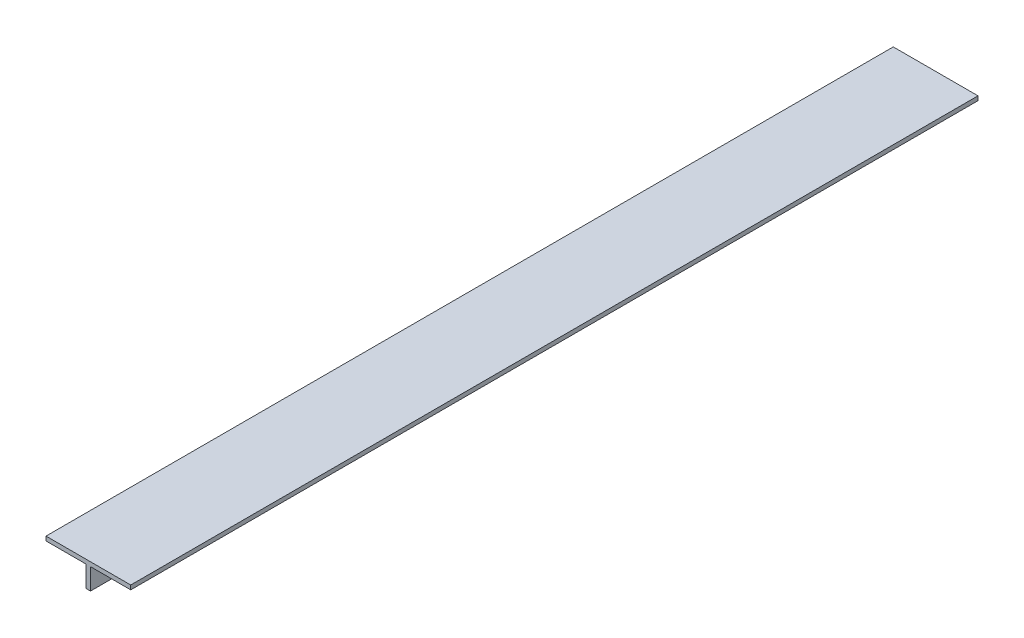
ISO-10303-21;
HEADER;
FILE_DESCRIPTION(('STEP AP214'),'2;1');
FILE_NAME('part.step','',(''),(''),'','','');
FILE_SCHEMA(('AUTOMOTIVE_DESIGN { 1 0 10303 214 1 1 1 1 }'));
ENDSEC;
DATA;
#1=APPLICATION_CONTEXT('core data for automotive mechanical design processes');
#2=APPLICATION_PROTOCOL_DEFINITION('international standard','automotive_design',2000,#1);
#3=PRODUCT_CONTEXT('',#1,'mechanical');
#4=PRODUCT('Part','Part','',(#3));
#5=PRODUCT_RELATED_PRODUCT_CATEGORY('part','',(#4));
#6=PRODUCT_DEFINITION_FORMATION('','',#4);
#7=PRODUCT_DEFINITION_CONTEXT('part definition',#1,'design');
#8=PRODUCT_DEFINITION('design','',#6,#7);
#9=PRODUCT_DEFINITION_SHAPE('','',#8);
#10=(LENGTH_UNIT() NAMED_UNIT(*) SI_UNIT(.MILLI.,.METRE.));
#11=(NAMED_UNIT(*) PLANE_ANGLE_UNIT() SI_UNIT($,.RADIAN.));
#12=(NAMED_UNIT(*) SI_UNIT($,.STERADIAN.) SOLID_ANGLE_UNIT());
#13=UNCERTAINTY_MEASURE_WITH_UNIT(LENGTH_MEASURE(1.E-05),#10,'distance_accuracy_value','');
#14=(GEOMETRIC_REPRESENTATION_CONTEXT(3) GLOBAL_UNCERTAINTY_ASSIGNED_CONTEXT((#13)) GLOBAL_UNIT_ASSIGNED_CONTEXT((#10,
#11,#12)) REPRESENTATION_CONTEXT('',''));
#15=CARTESIAN_POINT('',(0.,0.,0.));
#16=DIRECTION('',(0.,0.,1.));
#17=DIRECTION('',(1.,0.,0.));
#18=AXIS2_PLACEMENT_3D('',#15,#16,#17);
#19=CARTESIAN_POINT('',(0.,0.,50800.));
#20=DIRECTION('',(1.,0.,0.));
#21=DIRECTION('',(0.,1.,0.));
#22=AXIS2_PLACEMENT_3D('',#19,#20,#21);
#23=PLANE('',#22);
#24=DIRECTION('',(0.,-1.,0.));
#25=VECTOR('',#24,1.);
#26=CARTESIAN_POINT('',(0.,0.,0.));
#27=LINE('',#26,#25);
#28=CARTESIAN_POINT('',(0.,0.,0.));
#29=VERTEX_POINT('',#28);
#30=CARTESIAN_POINT('',(0.,-254.,0.));
#31=VERTEX_POINT('',#30);
#32=EDGE_CURVE('E132',#29,#31,#27,.T.);
#33=ORIENTED_EDGE('',*,*,#32,.T.);
#34=DIRECTION('',(0.,0.,-1.));
#35=VECTOR('',#34,1.);
#36=CARTESIAN_POINT('',(0.,-254.,50800.));
#37=LINE('',#36,#35);
#38=CARTESIAN_POINT('',(0.,-254.,50800.));
#39=VERTEX_POINT('',#38);
#40=EDGE_CURVE('E11',#39,#31,#37,.T.);
#41=ORIENTED_EDGE('',*,*,#40,.F.);
#42=DIRECTION('',(0.,-1.,0.));
#43=VECTOR('',#42,1.);
#44=CARTESIAN_POINT('',(0.,0.,50800.));
#45=LINE('',#44,#43);
#46=CARTESIAN_POINT('',(0.,0.,50800.));
#47=VERTEX_POINT('',#46);
#48=EDGE_CURVE('E146',#47,#39,#45,.T.);
#49=ORIENTED_EDGE('',*,*,#48,.F.);
#50=DIRECTION('',(0.,0.,-1.));
#51=VECTOR('',#50,1.);
#52=CARTESIAN_POINT('',(0.,0.,50800.));
#53=LINE('',#52,#51);
#54=EDGE_CURVE('E128',#47,#29,#53,.T.);
#55=ORIENTED_EDGE('',*,*,#54,.T.);
#56=EDGE_LOOP('',(#33,#41,#49,#55));
#57=FACE_BOUND('',#56,.T.);
#58=ADVANCED_FACE('F36',(#57),#23,.F.);
#59=CARTESIAN_POINT('',(0.,-254.,50800.));
#60=DIRECTION('',(0.,1.,0.));
#61=DIRECTION('',(0.,0.,1.));
#62=AXIS2_PLACEMENT_3D('',#59,#60,#61);
#63=PLANE('',#62);
#64=DIRECTION('',(1.,0.,0.));
#65=VECTOR('',#64,1.);
#66=CARTESIAN_POINT('',(0.,-254.,0.));
#67=LINE('',#66,#65);
#68=CARTESIAN_POINT('',(2413.,-254.,0.));
#69=VERTEX_POINT('',#68);
#70=EDGE_CURVE('E135',#31,#69,#67,.T.);
#71=ORIENTED_EDGE('',*,*,#70,.T.);
#72=DIRECTION('',(0.,0.,-1.));
#73=VECTOR('',#72,1.);
#74=CARTESIAN_POINT('',(2413.,-254.,50800.));
#75=LINE('',#74,#73);
#76=CARTESIAN_POINT('',(2413.,-254.,50800.));
#77=VERTEX_POINT('',#76);
#78=EDGE_CURVE('E44',#77,#69,#75,.T.);
#79=ORIENTED_EDGE('',*,*,#78,.F.);
#80=DIRECTION('',(1.,0.,0.));
#81=VECTOR('',#80,1.);
#82=CARTESIAN_POINT('',(0.,-254.,50800.));
#83=LINE('',#82,#81);
#84=EDGE_CURVE('E95',#39,#77,#83,.T.);
#85=ORIENTED_EDGE('',*,*,#84,.F.);
#86=ORIENTED_EDGE('',*,*,#40,.T.);
#87=EDGE_LOOP('',(#71,#79,#85,#86));
#88=FACE_BOUND('',#87,.T.);
#89=ADVANCED_FACE('F181',(#88),#63,.F.);
#90=CARTESIAN_POINT('',(2413.,-254.,50800.));
#91=DIRECTION('',(1.,0.,0.));
#92=DIRECTION('',(0.,0.,-1.));
#93=AXIS2_PLACEMENT_3D('',#90,#91,#92);
#94=PLANE('',#93);
#95=DIRECTION('',(0.,-1.,0.));
#96=VECTOR('',#95,1.);
#97=CARTESIAN_POINT('',(2413.,-254.,0.));
#98=LINE('',#97,#96);
#99=CARTESIAN_POINT('',(2413.,-1524.,0.));
#100=VERTEX_POINT('',#99);
#101=EDGE_CURVE('E137',#69,#100,#98,.T.);
#102=ORIENTED_EDGE('',*,*,#101,.T.);
#103=DIRECTION('',(0.,0.,-1.));
#104=VECTOR('',#103,1.);
#105=CARTESIAN_POINT('',(2413.,-1524.,50800.));
#106=LINE('',#105,#104);
#107=CARTESIAN_POINT('',(2413.,-1524.,50800.));
#108=VERTEX_POINT('',#107);
#109=EDGE_CURVE('E153',#108,#100,#106,.T.);
#110=ORIENTED_EDGE('',*,*,#109,.F.);
#111=DIRECTION('',(0.,-1.,0.));
#112=VECTOR('',#111,1.);
#113=CARTESIAN_POINT('',(2413.,-254.,50800.));
#114=LINE('',#113,#112);
#115=EDGE_CURVE('E161',#77,#108,#114,.T.);
#116=ORIENTED_EDGE('',*,*,#115,.F.);
#117=ORIENTED_EDGE('',*,*,#78,.T.);
#118=EDGE_LOOP('',(#102,#110,#116,#117));
#119=FACE_BOUND('',#118,.T.);
#120=ADVANCED_FACE('F159',(#119),#94,.F.);
#121=CARTESIAN_POINT('',(2413.,-1524.,50800.));
#122=DIRECTION('',(0.,1.,0.));
#123=DIRECTION('',(0.,0.,1.));
#124=AXIS2_PLACEMENT_3D('',#121,#122,#123);
#125=PLANE('',#124);
#126=DIRECTION('',(1.,0.,0.));
#127=VECTOR('',#126,1.);
#128=CARTESIAN_POINT('',(2413.,-1524.,0.));
#129=LINE('',#128,#127);
#130=CARTESIAN_POINT('',(2667.,-1524.,0.));
#131=VERTEX_POINT('',#130);
#132=EDGE_CURVE('E139',#100,#131,#129,.T.);
#133=ORIENTED_EDGE('',*,*,#132,.T.);
#134=DIRECTION('',(0.,0.,-1.));
#135=VECTOR('',#134,1.);
#136=CARTESIAN_POINT('',(2667.,-1524.,50800.));
#137=LINE('',#136,#135);
#138=CARTESIAN_POINT('',(2667.,-1524.,50800.));
#139=VERTEX_POINT('',#138);
#140=EDGE_CURVE('E150',#139,#131,#137,.T.);
#141=ORIENTED_EDGE('',*,*,#140,.F.);
#142=DIRECTION('',(1.,0.,0.));
#143=VECTOR('',#142,1.);
#144=CARTESIAN_POINT('',(2413.,-1524.,50800.));
#145=LINE('',#144,#143);
#146=EDGE_CURVE('E173',#108,#139,#145,.T.);
#147=ORIENTED_EDGE('',*,*,#146,.F.);
#148=ORIENTED_EDGE('',*,*,#109,.T.);
#149=EDGE_LOOP('',(#133,#141,#147,#148));
#150=FACE_BOUND('',#149,.T.);
#151=ADVANCED_FACE('F169',(#150),#125,.F.);
#152=CARTESIAN_POINT('',(2667.,-1524.,50800.));
#153=DIRECTION('',(-1.,0.,0.));
#154=DIRECTION('',(0.,0.,1.));
#155=AXIS2_PLACEMENT_3D('',#152,#153,#154);
#156=PLANE('',#155);
#157=DIRECTION('',(0.,1.,0.));
#158=VECTOR('',#157,1.);
#159=CARTESIAN_POINT('',(2667.,-1524.,0.));
#160=LINE('',#159,#158);
#161=CARTESIAN_POINT('',(2667.,-254.,0.));
#162=VERTEX_POINT('',#161);
#163=EDGE_CURVE('E141',#131,#162,#160,.T.);
#164=ORIENTED_EDGE('',*,*,#163,.T.);
#165=DIRECTION('',(0.,0.,-1.));
#166=VECTOR('',#165,1.);
#167=CARTESIAN_POINT('',(2667.,-254.,50800.));
#168=LINE('',#167,#166);
#169=CARTESIAN_POINT('',(2667.,-254.,50800.));
#170=VERTEX_POINT('',#169);
#171=EDGE_CURVE('E123',#170,#162,#168,.T.);
#172=ORIENTED_EDGE('',*,*,#171,.F.);
#173=DIRECTION('',(0.,1.,0.));
#174=VECTOR('',#173,1.);
#175=CARTESIAN_POINT('',(2667.,-1524.,50800.));
#176=LINE('',#175,#174);
#177=EDGE_CURVE('E114',#139,#170,#176,.T.);
#178=ORIENTED_EDGE('',*,*,#177,.F.);
#179=ORIENTED_EDGE('',*,*,#140,.T.);
#180=EDGE_LOOP('',(#164,#172,#178,#179));
#181=FACE_BOUND('',#180,.T.);
#182=ADVANCED_FACE('F172',(#181),#156,.F.);
#183=CARTESIAN_POINT('',(2667.,-254.,50800.));
#184=DIRECTION('',(0.,1.,0.));
#185=DIRECTION('',(0.,0.,1.));
#186=AXIS2_PLACEMENT_3D('',#183,#184,#185);
#187=PLANE('',#186);
#188=DIRECTION('',(1.,0.,0.));
#189=VECTOR('',#188,1.);
#190=CARTESIAN_POINT('',(2667.,-254.,0.));
#191=LINE('',#190,#189);
#192=CARTESIAN_POINT('',(5080.,-254.,0.));
#193=VERTEX_POINT('',#192);
#194=EDGE_CURVE('E122',#162,#193,#191,.T.);
#195=ORIENTED_EDGE('',*,*,#194,.T.);
#196=DIRECTION('',(0.,0.,-1.));
#197=VECTOR('',#196,1.);
#198=CARTESIAN_POINT('',(5080.,-254.,50800.));
#199=LINE('',#198,#197);
#200=CARTESIAN_POINT('',(5080.,-254.,50800.));
#201=VERTEX_POINT('',#200);
#202=EDGE_CURVE('E119',#201,#193,#199,.T.);
#203=ORIENTED_EDGE('',*,*,#202,.F.);
#204=DIRECTION('',(1.,0.,0.));
#205=VECTOR('',#204,1.);
#206=CARTESIAN_POINT('',(2667.,-254.,50800.));
#207=LINE('',#206,#205);
#208=EDGE_CURVE('E108',#170,#201,#207,.T.);
#209=ORIENTED_EDGE('',*,*,#208,.F.);
#210=ORIENTED_EDGE('',*,*,#171,.T.);
#211=EDGE_LOOP('',(#195,#203,#209,#210));
#212=FACE_BOUND('',#211,.T.);
#213=ADVANCED_FACE('F120',(#212),#187,.F.);
#214=CARTESIAN_POINT('',(5080.,-254.,50800.));
#215=DIRECTION('',(-1.,0.,0.));
#216=DIRECTION('',(0.,0.,1.));
#217=AXIS2_PLACEMENT_3D('',#214,#215,#216);
#218=PLANE('',#217);
#219=DIRECTION('',(0.,1.,0.));
#220=VECTOR('',#219,1.);
#221=CARTESIAN_POINT('',(5080.,-254.,0.));
#222=LINE('',#221,#220);
#223=CARTESIAN_POINT('',(5080.,0.,0.));
#224=VERTEX_POINT('',#223);
#225=EDGE_CURVE('E81',#193,#224,#222,.T.);
#226=ORIENTED_EDGE('',*,*,#225,.T.);
#227=DIRECTION('',(0.,0.,-1.));
#228=VECTOR('',#227,1.);
#229=CARTESIAN_POINT('',(5080.,0.,50800.));
#230=LINE('',#229,#228);
#231=CARTESIAN_POINT('',(5080.,0.,50800.));
#232=VERTEX_POINT('',#231);
#233=EDGE_CURVE('E124',#232,#224,#230,.T.);
#234=ORIENTED_EDGE('',*,*,#233,.F.);
#235=DIRECTION('',(0.,1.,0.));
#236=VECTOR('',#235,1.);
#237=CARTESIAN_POINT('',(5080.,-254.,50800.));
#238=LINE('',#237,#236);
#239=EDGE_CURVE('E112',#201,#232,#238,.T.);
#240=ORIENTED_EDGE('',*,*,#239,.F.);
#241=ORIENTED_EDGE('',*,*,#202,.T.);
#242=EDGE_LOOP('',(#226,#234,#240,#241));
#243=FACE_BOUND('',#242,.T.);
#244=ADVANCED_FACE('F126',(#243),#218,.F.);
#245=CARTESIAN_POINT('',(0.,0.,50800.));
#246=DIRECTION('',(0.,-1.,0.));
#247=DIRECTION('',(0.,0.,-1.));
#248=AXIS2_PLACEMENT_3D('',#245,#246,#247);
#249=PLANE('',#248);
#250=DIRECTION('',(-1.,0.,0.));
#251=VECTOR('',#250,1.);
#252=CARTESIAN_POINT('',(0.,0.,0.));
#253=LINE('',#252,#251);
#254=EDGE_CURVE('E87',#224,#29,#253,.T.);
#255=ORIENTED_EDGE('',*,*,#254,.T.);
#256=ORIENTED_EDGE('',*,*,#54,.F.);
#257=DIRECTION('',(-1.,0.,0.));
#258=VECTOR('',#257,1.);
#259=CARTESIAN_POINT('',(0.,0.,50800.));
#260=LINE('',#259,#258);
#261=EDGE_CURVE('E52',#232,#47,#260,.T.);
#262=ORIENTED_EDGE('',*,*,#261,.F.);
#263=ORIENTED_EDGE('',*,*,#233,.T.);
#264=EDGE_LOOP('',(#255,#256,#262,#263));
#265=FACE_BOUND('',#264,.T.);
#266=ADVANCED_FACE('F197',(#265),#249,.F.);
#267=CARTESIAN_POINT('',(0.,-254.,50800.));
#268=DIRECTION('',(0.,0.,1.));
#269=DIRECTION('',(1.,0.,0.));
#270=AXIS2_PLACEMENT_3D('',#267,#268,#269);
#271=PLANE('',#270);
#272=ORIENTED_EDGE('',*,*,#48,.T.);
#273=ORIENTED_EDGE('',*,*,#84,.T.);
#274=ORIENTED_EDGE('',*,*,#115,.T.);
#275=ORIENTED_EDGE('',*,*,#146,.T.);
#276=ORIENTED_EDGE('',*,*,#177,.T.);
#277=ORIENTED_EDGE('',*,*,#208,.T.);
#278=ORIENTED_EDGE('',*,*,#239,.T.);
#279=ORIENTED_EDGE('',*,*,#261,.T.);
#280=EDGE_LOOP('',(#272,#273,#274,#275,#276,#277,#278,#279));
#281=FACE_BOUND('',#280,.T.);
#282=ADVANCED_FACE('F110',(#281),#271,.T.);
#283=CARTESIAN_POINT('',(0.,-254.,0.));
#284=DIRECTION('',(0.,0.,1.));
#285=DIRECTION('',(1.,0.,0.));
#286=AXIS2_PLACEMENT_3D('',#283,#284,#285);
#287=PLANE('',#286);
#288=ORIENTED_EDGE('',*,*,#32,.F.);
#289=ORIENTED_EDGE('',*,*,#254,.F.);
#290=ORIENTED_EDGE('',*,*,#225,.F.);
#291=ORIENTED_EDGE('',*,*,#194,.F.);
#292=ORIENTED_EDGE('',*,*,#163,.F.);
#293=ORIENTED_EDGE('',*,*,#132,.F.);
#294=ORIENTED_EDGE('',*,*,#101,.F.);
#295=ORIENTED_EDGE('',*,*,#70,.F.);
#296=EDGE_LOOP('',(#288,#289,#290,#291,#292,#293,#294,#295));
#297=FACE_BOUND('',#296,.T.);
#298=ADVANCED_FACE('F165',(#297),#287,.F.);
#299=CLOSED_SHELL('',(#58,#89,#120,#151,#182,#213,#244,#266,#282,#298));
#300=MANIFOLD_SOLID_BREP('B2',#299);
#301=ADVANCED_BREP_SHAPE_REPRESENTATION('',(#18,#300),#14);
#302=SHAPE_DEFINITION_REPRESENTATION(#9,#301);
ENDSEC;
END-ISO-10303-21;
